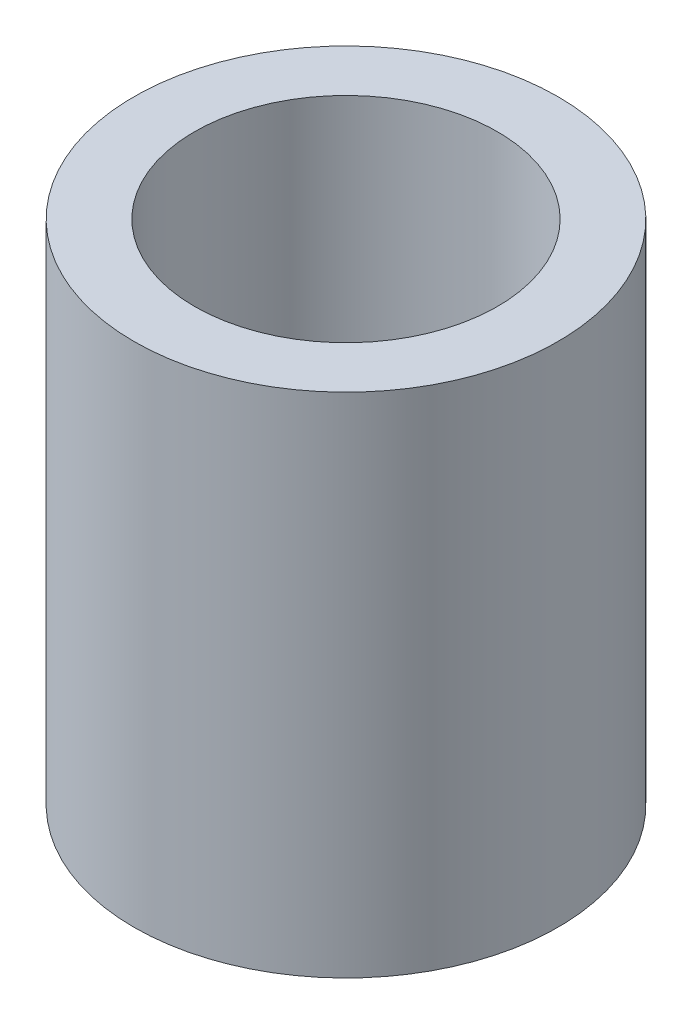
ISO-10303-21;
HEADER;
FILE_DESCRIPTION(('STEP AP214'),'2;1');
FILE_NAME('part.step','',(''),(''),'','','');
FILE_SCHEMA(('AUTOMOTIVE_DESIGN { 1 0 10303 214 1 1 1 1 }'));
ENDSEC;
DATA;
#1=APPLICATION_CONTEXT('core data for automotive mechanical design processes');
#2=APPLICATION_PROTOCOL_DEFINITION('international standard','automotive_design',2000,#1);
#3=PRODUCT_CONTEXT('',#1,'mechanical');
#4=PRODUCT('Part','Part','',(#3));
#5=PRODUCT_RELATED_PRODUCT_CATEGORY('part','',(#4));
#6=PRODUCT_DEFINITION_FORMATION('','',#4);
#7=PRODUCT_DEFINITION_CONTEXT('part definition',#1,'design');
#8=PRODUCT_DEFINITION('design','',#6,#7);
#9=PRODUCT_DEFINITION_SHAPE('','',#8);
#10=(LENGTH_UNIT() NAMED_UNIT(*) SI_UNIT(.MILLI.,.METRE.));
#11=(NAMED_UNIT(*) PLANE_ANGLE_UNIT() SI_UNIT($,.RADIAN.));
#12=(NAMED_UNIT(*) SI_UNIT($,.STERADIAN.) SOLID_ANGLE_UNIT());
#13=UNCERTAINTY_MEASURE_WITH_UNIT(LENGTH_MEASURE(1.E-05),#10,'distance_accuracy_value','');
#14=(GEOMETRIC_REPRESENTATION_CONTEXT(3) GLOBAL_UNCERTAINTY_ASSIGNED_CONTEXT((#13)) GLOBAL_UNIT_ASSIGNED_CONTEXT((#10,
#11,#12)) REPRESENTATION_CONTEXT('',''));
#15=CARTESIAN_POINT('',(0.,0.,0.));
#16=DIRECTION('',(0.,0.,1.));
#17=DIRECTION('',(1.,0.,0.));
#18=AXIS2_PLACEMENT_3D('',#15,#16,#17);
#19=CARTESIAN_POINT('',(0.,16.75,0.));
#20=DIRECTION('',(0.,1.,0.));
#21=DIRECTION('',(0.,0.,1.));
#22=AXIS2_PLACEMENT_3D('',#19,#20,#21);
#23=PLANE('',#22);
#24=CARTESIAN_POINT('',(0.,16.75,0.));
#25=DIRECTION('',(0.,1.,0.));
#26=DIRECTION('',(0.,0.,1.));
#27=AXIS2_PLACEMENT_3D('',#24,#25,#26);
#28=CIRCLE('',#27,14.);
#29=CARTESIAN_POINT('',(0.,16.75,14.));
#30=VERTEX_POINT('',#29);
#31=EDGE_CURVE('E10',#30,#30,#28,.T.);
#32=ORIENTED_EDGE('',*,*,#31,.T.);
#33=EDGE_LOOP('',(#32));
#34=FACE_BOUND('',#33,.T.);
#35=CARTESIAN_POINT('',(0.,16.75,0.));
#36=DIRECTION('',(0.,1.,0.));
#37=DIRECTION('',(0.,0.,1.));
#38=AXIS2_PLACEMENT_3D('',#35,#36,#37);
#39=CIRCLE('',#38,10.);
#40=CARTESIAN_POINT('',(0.,16.75,10.));
#41=VERTEX_POINT('',#40);
#42=EDGE_CURVE('E52',#41,#41,#39,.T.);
#43=ORIENTED_EDGE('',*,*,#42,.F.);
#44=EDGE_LOOP('',(#43));
#45=FACE_BOUND('',#44,.T.);
#46=ADVANCED_FACE('F39',(#34,#45),#23,.T.);
#47=CARTESIAN_POINT('',(0.,-16.75,0.));
#48=DIRECTION('',(0.,1.,0.));
#49=DIRECTION('',(0.,0.,1.));
#50=AXIS2_PLACEMENT_3D('',#47,#48,#49);
#51=PLANE('',#50);
#52=CARTESIAN_POINT('',(0.,-16.75,0.));
#53=DIRECTION('',(0.,1.,0.));
#54=DIRECTION('',(0.,0.,1.));
#55=AXIS2_PLACEMENT_3D('',#52,#53,#54);
#56=CIRCLE('',#55,14.);
#57=CARTESIAN_POINT('',(0.,-16.75,14.));
#58=VERTEX_POINT('',#57);
#59=EDGE_CURVE('E43',#58,#58,#56,.T.);
#60=ORIENTED_EDGE('',*,*,#59,.F.);
#61=EDGE_LOOP('',(#60));
#62=FACE_BOUND('',#61,.T.);
#63=CARTESIAN_POINT('',(0.,-16.75,0.));
#64=DIRECTION('',(0.,1.,0.));
#65=DIRECTION('',(0.,0.,1.));
#66=AXIS2_PLACEMENT_3D('',#63,#64,#65);
#67=CIRCLE('',#66,10.);
#68=CARTESIAN_POINT('',(0.,-16.75,10.));
#69=VERTEX_POINT('',#68);
#70=EDGE_CURVE('E54',#69,#69,#67,.T.);
#71=ORIENTED_EDGE('',*,*,#70,.T.);
#72=EDGE_LOOP('',(#71));
#73=FACE_BOUND('',#72,.T.);
#74=ADVANCED_FACE('F66',(#62,#73),#51,.F.);
#75=CARTESIAN_POINT('',(0.,16.75,0.));
#76=DIRECTION('',(0.,-1.,0.));
#77=DIRECTION('',(0.,0.,-1.));
#78=AXIS2_PLACEMENT_3D('',#75,#76,#77);
#79=CYLINDRICAL_SURFACE('',#78,14.);
#80=ORIENTED_EDGE('',*,*,#31,.F.);
#81=EDGE_LOOP('',(#80));
#82=FACE_BOUND('',#81,.T.);
#83=ORIENTED_EDGE('',*,*,#59,.T.);
#84=EDGE_LOOP('',(#83));
#85=FACE_BOUND('',#84,.T.);
#86=ADVANCED_FACE('F41',(#82,#85),#79,.T.);
#87=CARTESIAN_POINT('',(0.,16.75,0.));
#88=DIRECTION('',(0.,-1.,0.));
#89=DIRECTION('',(0.,0.,-1.));
#90=AXIS2_PLACEMENT_3D('',#87,#88,#89);
#91=CYLINDRICAL_SURFACE('',#90,10.);
#92=ORIENTED_EDGE('',*,*,#42,.T.);
#93=EDGE_LOOP('',(#92));
#94=FACE_BOUND('',#93,.T.);
#95=ORIENTED_EDGE('',*,*,#70,.F.);
#96=EDGE_LOOP('',(#95));
#97=FACE_BOUND('',#96,.T.);
#98=ADVANCED_FACE('F62',(#94,#97),#91,.F.);
#99=CLOSED_SHELL('',(#46,#74,#86,#98));
#100=MANIFOLD_SOLID_BREP('B2',#99);
#101=ADVANCED_BREP_SHAPE_REPRESENTATION('',(#18,#100),#14);
#102=SHAPE_DEFINITION_REPRESENTATION(#9,#101);
ENDSEC;
END-ISO-10303-21;
